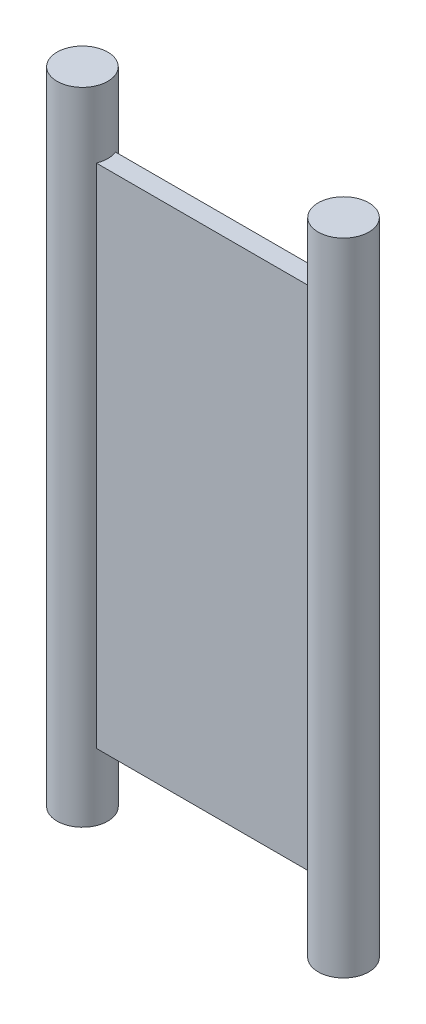
ISO-10303-21;
HEADER;
FILE_DESCRIPTION(('STEP AP214'),'2;1');
FILE_NAME('part.step','',(''),(''),'','','');
FILE_SCHEMA(('AUTOMOTIVE_DESIGN { 1 0 10303 214 1 1 1 1 }'));
ENDSEC;
DATA;
#1=APPLICATION_CONTEXT('core data for automotive mechanical design processes');
#2=APPLICATION_PROTOCOL_DEFINITION('international standard','automotive_design',2000,#1);
#3=PRODUCT_CONTEXT('',#1,'mechanical');
#4=PRODUCT('Part','Part','',(#3));
#5=PRODUCT_RELATED_PRODUCT_CATEGORY('part','',(#4));
#6=PRODUCT_DEFINITION_FORMATION('','',#4);
#7=PRODUCT_DEFINITION_CONTEXT('part definition',#1,'design');
#8=PRODUCT_DEFINITION('design','',#6,#7);
#9=PRODUCT_DEFINITION_SHAPE('','',#8);
#10=(LENGTH_UNIT() NAMED_UNIT(*) SI_UNIT(.MILLI.,.METRE.));
#11=(NAMED_UNIT(*) PLANE_ANGLE_UNIT() SI_UNIT($,.RADIAN.));
#12=(NAMED_UNIT(*) SI_UNIT($,.STERADIAN.) SOLID_ANGLE_UNIT());
#13=UNCERTAINTY_MEASURE_WITH_UNIT(LENGTH_MEASURE(1.E-05),#10,'distance_accuracy_value','');
#14=(GEOMETRIC_REPRESENTATION_CONTEXT(3) GLOBAL_UNCERTAINTY_ASSIGNED_CONTEXT((#13)) GLOBAL_UNIT_ASSIGNED_CONTEXT((#10,
#11,#12)) REPRESENTATION_CONTEXT('',''));
#15=CARTESIAN_POINT('',(0.,0.,0.));
#16=DIRECTION('',(0.,0.,1.));
#17=DIRECTION('',(1.,0.,0.));
#18=AXIS2_PLACEMENT_3D('',#15,#16,#17);
#19=CARTESIAN_POINT('',(6.825,26.5,0.499999999999999));
#20=DIRECTION('',(0.,0.,-1.));
#21=DIRECTION('',(-1.,0.,0.));
#22=AXIS2_PLACEMENT_3D('',#19,#20,#21);
#23=PLANE('',#22);
#24=DIRECTION('',(0.,-1.,0.));
#25=VECTOR('',#24,1.);
#26=CARTESIAN_POINT('',(5.5979608808192,30.,0.499999999999999));
#27=LINE('',#26,#25);
#28=CARTESIAN_POINT('',(5.5979608808192,26.5,0.499999999999999));
#29=VERTEX_POINT('',#28);
#30=CARTESIAN_POINT('',(5.5979608808192,0.,0.499999999999999));
#31=VERTEX_POINT('',#30);
#32=EDGE_CURVE('E53',#29,#31,#27,.T.);
#33=ORIENTED_EDGE('',*,*,#32,.F.);
#34=DIRECTION('',(1.,0.,0.));
#35=VECTOR('',#34,1.);
#36=CARTESIAN_POINT('',(6.825,26.5,0.499999999999999));
#37=LINE('',#36,#35);
#38=CARTESIAN_POINT('',(-5.5979608808192,26.5,0.500000000000001));
#39=VERTEX_POINT('',#38);
#40=EDGE_CURVE('E90',#39,#29,#37,.T.);
#41=ORIENTED_EDGE('',*,*,#40,.F.);
#42=DIRECTION('',(0.,-1.,0.));
#43=VECTOR('',#42,1.);
#44=CARTESIAN_POINT('',(-5.5979608808192,30.,0.500000000000001));
#45=LINE('',#44,#43);
#46=CARTESIAN_POINT('',(-5.5979608808192,0.,0.500000000000001));
#47=VERTEX_POINT('',#46);
#48=EDGE_CURVE('E103',#47,#39,#45,.F.);
#49=ORIENTED_EDGE('',*,*,#48,.F.);
#50=DIRECTION('',(1.,0.,0.));
#51=VECTOR('',#50,1.);
#52=CARTESIAN_POINT('',(6.825,0.,0.499999999999999));
#53=LINE('',#52,#51);
#54=EDGE_CURVE('E91',#47,#31,#53,.T.);
#55=ORIENTED_EDGE('',*,*,#54,.T.);
#56=EDGE_LOOP('',(#33,#41,#49,#55));
#57=FACE_BOUND('',#56,.T.);
#58=ADVANCED_FACE('F39',(#57),#23,.F.);
#59=CARTESIAN_POINT('',(6.825,26.5,-0.500000000000001));
#60=DIRECTION('',(0.,0.,1.));
#61=DIRECTION('',(1.,0.,0.));
#62=AXIS2_PLACEMENT_3D('',#59,#60,#61);
#63=PLANE('',#62);
#64=DIRECTION('',(0.,-1.,0.));
#65=VECTOR('',#64,1.);
#66=CARTESIAN_POINT('',(5.5979608808192,30.,-0.500000000000001));
#67=LINE('',#66,#65);
#68=CARTESIAN_POINT('',(5.5979608808192,0.,-0.500000000000001));
#69=VERTEX_POINT('',#68);
#70=CARTESIAN_POINT('',(5.5979608808192,26.5,-0.500000000000001));
#71=VERTEX_POINT('',#70);
#72=EDGE_CURVE('E78',#69,#71,#67,.F.);
#73=ORIENTED_EDGE('',*,*,#72,.F.);
#74=DIRECTION('',(-1.,0.,0.));
#75=VECTOR('',#74,1.);
#76=CARTESIAN_POINT('',(6.825,0.,-0.500000000000001));
#77=LINE('',#76,#75);
#78=CARTESIAN_POINT('',(-5.5979608808192,0.,-0.499999999999999));
#79=VERTEX_POINT('',#78);
#80=EDGE_CURVE('E60',#69,#79,#77,.T.);
#81=ORIENTED_EDGE('',*,*,#80,.T.);
#82=DIRECTION('',(0.,-1.,0.));
#83=VECTOR('',#82,1.);
#84=CARTESIAN_POINT('',(-5.5979608808192,30.,-0.499999999999999));
#85=LINE('',#84,#83);
#86=CARTESIAN_POINT('',(-5.5979608808192,26.5,-0.499999999999999));
#87=VERTEX_POINT('',#86);
#88=EDGE_CURVE('E105',#87,#79,#85,.T.);
#89=ORIENTED_EDGE('',*,*,#88,.F.);
#90=DIRECTION('',(-1.,0.,0.));
#91=VECTOR('',#90,1.);
#92=CARTESIAN_POINT('',(6.825,26.5,-0.500000000000001));
#93=LINE('',#92,#91);
#94=EDGE_CURVE('E85',#71,#87,#93,.T.);
#95=ORIENTED_EDGE('',*,*,#94,.F.);
#96=EDGE_LOOP('',(#73,#81,#89,#95));
#97=FACE_BOUND('',#96,.T.);
#98=ADVANCED_FACE('F84',(#97),#63,.F.);
#99=CARTESIAN_POINT('',(-6.825,30.,0.));
#100=DIRECTION('',(0.,-1.,0.));
#101=DIRECTION('',(0.,0.,-1.));
#102=AXIS2_PLACEMENT_3D('',#99,#100,#101);
#103=CYLINDRICAL_SURFACE('',#102,1.325);
#104=CARTESIAN_POINT('',(-6.825,30.,0.));
#105=DIRECTION('',(0.,1.,0.));
#106=DIRECTION('',(0.,0.,1.));
#107=AXIS2_PLACEMENT_3D('',#104,#105,#106);
#108=CIRCLE('',#107,1.325);
#109=CARTESIAN_POINT('',(-6.825,30.,1.325));
#110=VERTEX_POINT('',#109);
#111=EDGE_CURVE('E107',#110,#110,#108,.T.);
#112=ORIENTED_EDGE('',*,*,#111,.F.);
#113=EDGE_LOOP('',(#112));
#114=FACE_BOUND('',#113,.T.);
#115=CARTESIAN_POINT('',(-6.825,-3.5,0.));
#116=DIRECTION('',(0.,1.,0.));
#117=DIRECTION('',(0.,0.,1.));
#118=AXIS2_PLACEMENT_3D('',#115,#116,#117);
#119=CIRCLE('',#118,1.325);
#120=CARTESIAN_POINT('',(-6.825,-3.5,1.325));
#121=VERTEX_POINT('',#120);
#122=EDGE_CURVE('E108',#121,#121,#119,.T.);
#123=ORIENTED_EDGE('',*,*,#122,.T.);
#124=EDGE_LOOP('',(#123));
#125=FACE_BOUND('',#124,.T.);
#126=ORIENTED_EDGE('',*,*,#48,.T.);
#127=CARTESIAN_POINT('',(-6.825,26.5,0.));
#128=DIRECTION('',(0.,-1.,0.));
#129=DIRECTION('',(0.,0.,-1.));
#130=AXIS2_PLACEMENT_3D('',#127,#128,#129);
#131=CIRCLE('',#130,1.325);
#132=EDGE_CURVE('E95',#39,#87,#131,.F.);
#133=ORIENTED_EDGE('',*,*,#132,.T.);
#134=ORIENTED_EDGE('',*,*,#88,.T.);
#135=CARTESIAN_POINT('',(-6.825,0.,0.));
#136=DIRECTION('',(0.,-1.,0.));
#137=DIRECTION('',(0.,0.,-1.));
#138=AXIS2_PLACEMENT_3D('',#135,#136,#137);
#139=CIRCLE('',#138,1.325);
#140=EDGE_CURVE('E46',#47,#79,#139,.F.);
#141=ORIENTED_EDGE('',*,*,#140,.F.);
#142=EDGE_LOOP('',(#126,#133,#134,#141));
#143=FACE_BOUND('',#142,.T.);
#144=ADVANCED_FACE('F138',(#114,#125,#143),#103,.T.);
#145=CARTESIAN_POINT('',(-6.825,30.,0.));
#146=DIRECTION('',(0.,1.,0.));
#147=DIRECTION('',(0.,0.,1.));
#148=AXIS2_PLACEMENT_3D('',#145,#146,#147);
#149=PLANE('',#148);
#150=ORIENTED_EDGE('',*,*,#111,.T.);
#151=EDGE_LOOP('',(#150));
#152=FACE_BOUND('',#151,.T.);
#153=ADVANCED_FACE('F144',(#152),#149,.T.);
#154=CARTESIAN_POINT('',(-6.825,-3.5,0.));
#155=DIRECTION('',(0.,1.,0.));
#156=DIRECTION('',(0.,0.,1.));
#157=AXIS2_PLACEMENT_3D('',#154,#155,#156);
#158=PLANE('',#157);
#159=ORIENTED_EDGE('',*,*,#122,.F.);
#160=EDGE_LOOP('',(#159));
#161=FACE_BOUND('',#160,.T.);
#162=ADVANCED_FACE('F150',(#161),#158,.F.);
#163=CARTESIAN_POINT('',(0.,26.5,0.));
#164=DIRECTION('',(0.,-1.,0.));
#165=DIRECTION('',(0.,0.,-1.));
#166=AXIS2_PLACEMENT_3D('',#163,#164,#165);
#167=PLANE('',#166);
#168=CARTESIAN_POINT('',(6.825,26.5,0.));
#169=DIRECTION('',(0.,-1.,0.));
#170=DIRECTION('',(0.,0.,-1.));
#171=AXIS2_PLACEMENT_3D('',#168,#169,#170);
#172=CIRCLE('',#171,1.325);
#173=EDGE_CURVE('E111',#71,#29,#172,.F.);
#174=ORIENTED_EDGE('',*,*,#173,.F.);
#175=ORIENTED_EDGE('',*,*,#94,.T.);
#176=ORIENTED_EDGE('',*,*,#132,.F.);
#177=ORIENTED_EDGE('',*,*,#40,.T.);
#178=EDGE_LOOP('',(#174,#175,#176,#177));
#179=FACE_BOUND('',#178,.T.);
#180=ADVANCED_FACE('F141',(#179),#167,.F.);
#181=CARTESIAN_POINT('',(0.,0.,0.));
#182=DIRECTION('',(0.,-1.,0.));
#183=DIRECTION('',(0.,0.,-1.));
#184=AXIS2_PLACEMENT_3D('',#181,#182,#183);
#185=PLANE('',#184);
#186=ORIENTED_EDGE('',*,*,#80,.F.);
#187=CARTESIAN_POINT('',(6.825,0.,0.));
#188=DIRECTION('',(0.,-1.,0.));
#189=DIRECTION('',(0.,0.,-1.));
#190=AXIS2_PLACEMENT_3D('',#187,#188,#189);
#191=CIRCLE('',#190,1.325);
#192=EDGE_CURVE('E11',#69,#31,#191,.F.);
#193=ORIENTED_EDGE('',*,*,#192,.T.);
#194=ORIENTED_EDGE('',*,*,#54,.F.);
#195=ORIENTED_EDGE('',*,*,#140,.T.);
#196=EDGE_LOOP('',(#186,#193,#194,#195));
#197=FACE_BOUND('',#196,.T.);
#198=ADVANCED_FACE('F89',(#197),#185,.T.);
#199=CARTESIAN_POINT('',(6.825,30.,0.));
#200=DIRECTION('',(0.,-1.,0.));
#201=DIRECTION('',(0.,0.,-1.));
#202=AXIS2_PLACEMENT_3D('',#199,#200,#201);
#203=CYLINDRICAL_SURFACE('',#202,1.325);
#204=CARTESIAN_POINT('',(6.825,30.,0.));
#205=DIRECTION('',(0.,1.,0.));
#206=DIRECTION('',(0.,0.,1.));
#207=AXIS2_PLACEMENT_3D('',#204,#205,#206);
#208=CIRCLE('',#207,1.325);
#209=CARTESIAN_POINT('',(6.825,30.,1.325));
#210=VERTEX_POINT('',#209);
#211=EDGE_CURVE('E116',#210,#210,#208,.T.);
#212=ORIENTED_EDGE('',*,*,#211,.F.);
#213=EDGE_LOOP('',(#212));
#214=FACE_BOUND('',#213,.T.);
#215=CARTESIAN_POINT('',(6.825,-3.5,0.));
#216=DIRECTION('',(0.,1.,0.));
#217=DIRECTION('',(0.,0.,1.));
#218=AXIS2_PLACEMENT_3D('',#215,#216,#217);
#219=CIRCLE('',#218,1.325);
#220=CARTESIAN_POINT('',(6.825,-3.5,1.325));
#221=VERTEX_POINT('',#220);
#222=EDGE_CURVE('E86',#221,#221,#219,.T.);
#223=ORIENTED_EDGE('',*,*,#222,.T.);
#224=EDGE_LOOP('',(#223));
#225=FACE_BOUND('',#224,.T.);
#226=ORIENTED_EDGE('',*,*,#72,.T.);
#227=ORIENTED_EDGE('',*,*,#173,.T.);
#228=ORIENTED_EDGE('',*,*,#32,.T.);
#229=ORIENTED_EDGE('',*,*,#192,.F.);
#230=EDGE_LOOP('',(#226,#227,#228,#229));
#231=FACE_BOUND('',#230,.T.);
#232=ADVANCED_FACE('F77',(#214,#225,#231),#203,.T.);
#233=CARTESIAN_POINT('',(6.825,30.,0.));
#234=DIRECTION('',(0.,1.,0.));
#235=DIRECTION('',(0.,0.,1.));
#236=AXIS2_PLACEMENT_3D('',#233,#234,#235);
#237=PLANE('',#236);
#238=ORIENTED_EDGE('',*,*,#211,.T.);
#239=EDGE_LOOP('',(#238));
#240=FACE_BOUND('',#239,.T.);
#241=ADVANCED_FACE('F125',(#240),#237,.T.);
#242=CARTESIAN_POINT('',(6.825,-3.5,0.));
#243=DIRECTION('',(0.,1.,0.));
#244=DIRECTION('',(0.,0.,1.));
#245=AXIS2_PLACEMENT_3D('',#242,#243,#244);
#246=PLANE('',#245);
#247=ORIENTED_EDGE('',*,*,#222,.F.);
#248=EDGE_LOOP('',(#247));
#249=FACE_BOUND('',#248,.T.);
#250=ADVANCED_FACE('F123',(#249),#246,.F.);
#251=CLOSED_SHELL('',(#58,#98,#144,#153,#162,#180,#198,#232,#241,#250));
#252=MANIFOLD_SOLID_BREP('B2',#251);
#253=ADVANCED_BREP_SHAPE_REPRESENTATION('',(#18,#252),#14);
#254=SHAPE_DEFINITION_REPRESENTATION(#9,#253);
ENDSEC;
END-ISO-10303-21;
